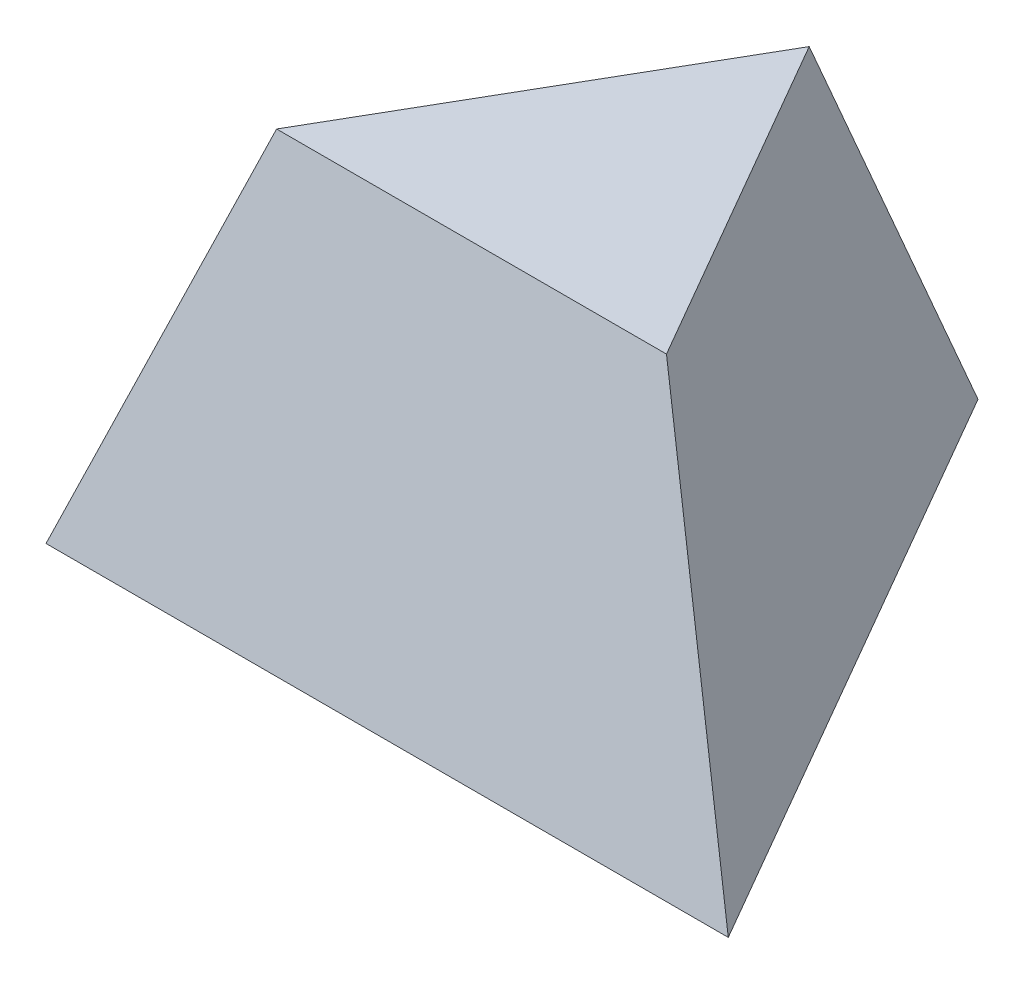
ISO-10303-21;
HEADER;
FILE_DESCRIPTION(('STEP AP214'),'2;1');
FILE_NAME('part.step','',(''),(''),'','','');
FILE_SCHEMA(('AUTOMOTIVE_DESIGN { 1 0 10303 214 1 1 1 1 }'));
ENDSEC;
DATA;
#1=APPLICATION_CONTEXT('core data for automotive mechanical design processes');
#2=APPLICATION_PROTOCOL_DEFINITION('international standard','automotive_design',2000,#1);
#3=PRODUCT_CONTEXT('',#1,'mechanical');
#4=PRODUCT('Part','Part','',(#3));
#5=PRODUCT_RELATED_PRODUCT_CATEGORY('part','',(#4));
#6=PRODUCT_DEFINITION_FORMATION('','',#4);
#7=PRODUCT_DEFINITION_CONTEXT('part definition',#1,'design');
#8=PRODUCT_DEFINITION('design','',#6,#7);
#9=PRODUCT_DEFINITION_SHAPE('','',#8);
#10=(LENGTH_UNIT() NAMED_UNIT(*) SI_UNIT(.MILLI.,.METRE.));
#11=(NAMED_UNIT(*) PLANE_ANGLE_UNIT() SI_UNIT($,.RADIAN.));
#12=(NAMED_UNIT(*) SI_UNIT($,.STERADIAN.) SOLID_ANGLE_UNIT());
#13=UNCERTAINTY_MEASURE_WITH_UNIT(LENGTH_MEASURE(1.E-05),#10,'distance_accuracy_value','');
#14=(GEOMETRIC_REPRESENTATION_CONTEXT(3) GLOBAL_UNCERTAINTY_ASSIGNED_CONTEXT((#13)) GLOBAL_UNIT_ASSIGNED_CONTEXT((#10,
#11,#12)) REPRESENTATION_CONTEXT('',''));
#15=CARTESIAN_POINT('',(0.,0.,0.));
#16=DIRECTION('',(0.,0.,1.));
#17=DIRECTION('',(1.,0.,0.));
#18=AXIS2_PLACEMENT_3D('',#15,#16,#17);
#19=CARTESIAN_POINT('',(0.,101.6,0.));
#20=DIRECTION('',(0.,1.,0.));
#21=DIRECTION('',(0.,0.,1.));
#22=AXIS2_PLACEMENT_3D('',#19,#20,#21);
#23=PLANE('',#22);
#24=DIRECTION('',(1.,0.,0.));
#25=VECTOR('',#24,1.);
#26=CARTESIAN_POINT('',(0.,101.6,29.329393674833));
#27=LINE('',#26,#25);
#28=CARTESIAN_POINT('',(-50.8,101.6,29.329393674833));
#29=VERTEX_POINT('',#28);
#30=CARTESIAN_POINT('',(50.8,101.6,29.329393674833));
#31=VERTEX_POINT('',#30);
#32=EDGE_CURVE('E90',#29,#31,#27,.T.);
#33=ORIENTED_EDGE('',*,*,#32,.T.);
#34=DIRECTION('',(-0.5,0.,-0.866025403784439));
#35=VECTOR('',#34,1.);
#36=CARTESIAN_POINT('',(25.4,101.6,-14.6646968374165));
#37=LINE('',#36,#35);
#38=CARTESIAN_POINT('',(0.,101.6,-58.658787349666));
#39=VERTEX_POINT('',#38);
#40=EDGE_CURVE('E56',#31,#39,#37,.T.);
#41=ORIENTED_EDGE('',*,*,#40,.T.);
#42=DIRECTION('',(-0.5,0.,0.866025403784439));
#43=VECTOR('',#42,1.);
#44=CARTESIAN_POINT('',(-25.4,101.6,-14.6646968374165));
#45=LINE('',#44,#43);
#46=EDGE_CURVE('E62',#39,#29,#45,.T.);
#47=ORIENTED_EDGE('',*,*,#46,.T.);
#48=EDGE_LOOP('',(#33,#41,#47));
#49=FACE_BOUND('',#48,.T.);
#50=ADVANCED_FACE('F41',(#49),#23,.T.);
#51=CARTESIAN_POINT('',(-42.4597014925373,10.6149253731343,-24.5141200864276));
#52=DIRECTION('',(-0.846414739030318,0.21160368475758,-0.488677777425221));
#53=DIRECTION('',(-0.5,0.,0.866025403784439));
#54=AXIS2_PLACEMENT_3D('',#51,#52,#53);
#55=PLANE('',#54);
#56=ORIENTED_EDGE('',*,*,#46,.F.);
#57=DIRECTION('',(0.,-0.917662935482247,-0.397359707119513));
#58=VECTOR('',#57,1.);
#59=CARTESIAN_POINT('',(0.,37.4315789473685,-86.4445287258236));
#60=LINE('',#59,#58);
#61=CARTESIAN_POINT('',(0.,0.,-102.652877861915));
#62=VERTEX_POINT('',#61);
#63=EDGE_CURVE('E95',#39,#62,#60,.T.);
#64=ORIENTED_EDGE('',*,*,#63,.T.);
#65=DIRECTION('',(-0.5,0.,0.866025403784439));
#66=VECTOR('',#65,1.);
#67=CARTESIAN_POINT('',(0.,0.,-102.652877861915));
#68=LINE('',#67,#66);
#69=CARTESIAN_POINT('',(-88.9000000000001,0.,51.3264389309577));
#70=VERTEX_POINT('',#69);
#71=EDGE_CURVE('E86',#62,#70,#68,.T.);
#72=ORIENTED_EDGE('',*,*,#71,.T.);
#73=DIRECTION('',(0.344123600805843,0.917662935482247,-0.198679853559757));
#74=VECTOR('',#73,1.);
#75=CARTESIAN_POINT('',(-74.8631578947369,37.4315789473685,43.2222643629118));
#76=LINE('',#75,#74);
#77=EDGE_CURVE('E49',#70,#29,#76,.T.);
#78=ORIENTED_EDGE('',*,*,#77,.T.);
#79=EDGE_LOOP('',(#56,#64,#72,#78));
#80=FACE_BOUND('',#79,.T.);
#81=ADVANCED_FACE('F94',(#80),#55,.T.);
#82=CARTESIAN_POINT('',(0.,10.6149253731343,49.0282401728552));
#83=DIRECTION('',(0.,0.21160368475758,0.977355554850442));
#84=DIRECTION('',(0.,-0.977355554850442,0.21160368475758));
#85=AXIS2_PLACEMENT_3D('',#82,#83,#84);
#86=PLANE('',#85);
#87=DIRECTION('',(1.,0.,0.));
#88=VECTOR('',#87,1.);
#89=CARTESIAN_POINT('',(-88.9,0.,51.3264389309577));
#90=LINE('',#89,#88);
#91=CARTESIAN_POINT('',(88.9,0.,51.3264389309577));
#92=VERTEX_POINT('',#91);
#93=EDGE_CURVE('E80',#70,#92,#90,.T.);
#94=ORIENTED_EDGE('',*,*,#93,.T.);
#95=DIRECTION('',(-0.344123600805843,0.917662935482247,-0.198679853559757));
#96=VECTOR('',#95,1.);
#97=CARTESIAN_POINT('',(74.8631578947369,37.4315789473684,43.2222643629118));
#98=LINE('',#97,#96);
#99=EDGE_CURVE('E11',#92,#31,#98,.T.);
#100=ORIENTED_EDGE('',*,*,#99,.T.);
#101=ORIENTED_EDGE('',*,*,#32,.F.);
#102=ORIENTED_EDGE('',*,*,#77,.F.);
#103=EDGE_LOOP('',(#94,#100,#101,#102));
#104=FACE_BOUND('',#103,.T.);
#105=ADVANCED_FACE('F81',(#104),#86,.T.);
#106=CARTESIAN_POINT('',(0.,0.,0.));
#107=DIRECTION('',(0.,1.,0.));
#108=DIRECTION('',(0.,0.,1.));
#109=AXIS2_PLACEMENT_3D('',#106,#107,#108);
#110=PLANE('',#109);
#111=DIRECTION('',(-0.5,0.,-0.866025403784439));
#112=VECTOR('',#111,1.);
#113=CARTESIAN_POINT('',(88.9,0.,51.3264389309577));
#114=LINE('',#113,#112);
#115=EDGE_CURVE('E76',#92,#62,#114,.T.);
#116=ORIENTED_EDGE('',*,*,#115,.F.);
#117=ORIENTED_EDGE('',*,*,#93,.F.);
#118=ORIENTED_EDGE('',*,*,#71,.F.);
#119=EDGE_LOOP('',(#116,#117,#118));
#120=FACE_BOUND('',#119,.T.);
#121=ADVANCED_FACE('F43',(#120),#110,.F.);
#122=CARTESIAN_POINT('',(42.4597014925373,10.6149253731343,-24.5141200864276));
#123=DIRECTION('',(0.846414739030318,0.211603684757579,-0.488677777425221));
#124=DIRECTION('',(-0.5,0.,-0.866025403784439));
#125=AXIS2_PLACEMENT_3D('',#122,#123,#124);
#126=PLANE('',#125);
#127=ORIENTED_EDGE('',*,*,#99,.F.);
#128=ORIENTED_EDGE('',*,*,#115,.T.);
#129=ORIENTED_EDGE('',*,*,#63,.F.);
#130=ORIENTED_EDGE('',*,*,#40,.F.);
#131=EDGE_LOOP('',(#127,#128,#129,#130));
#132=FACE_BOUND('',#131,.T.);
#133=ADVANCED_FACE('F74',(#132),#126,.T.);
#134=CLOSED_SHELL('',(#50,#81,#105,#121,#133));
#135=MANIFOLD_SOLID_BREP('B2',#134);
#136=ADVANCED_BREP_SHAPE_REPRESENTATION('',(#18,#135),#14);
#137=SHAPE_DEFINITION_REPRESENTATION(#9,#136);
ENDSEC;
END-ISO-10303-21;
